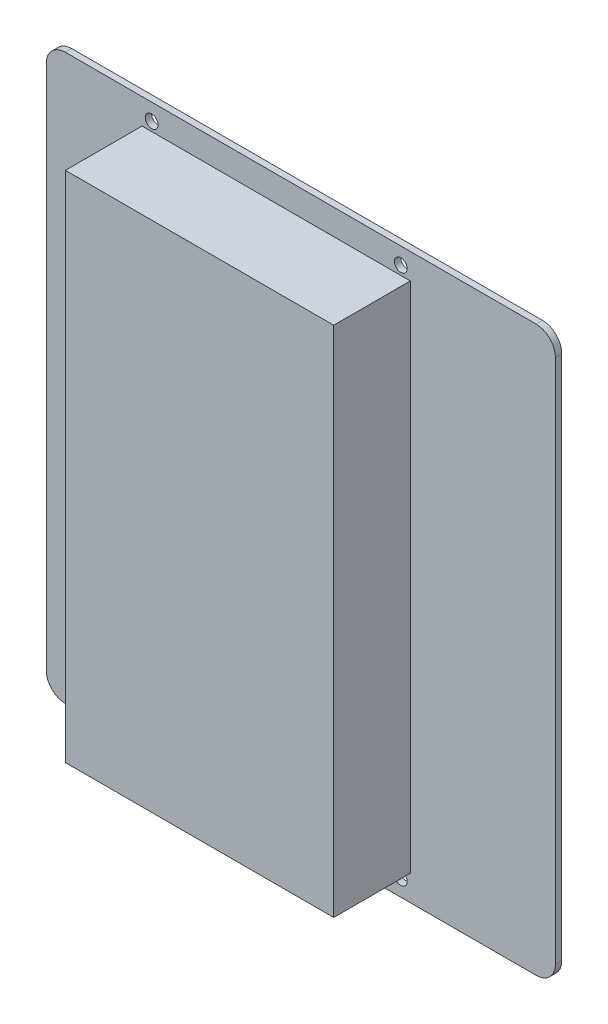
ISO-10303-21;
HEADER;
FILE_DESCRIPTION(('STEP AP214'),'2;1');
FILE_NAME('part.step','',(''),(''),'','','');
FILE_SCHEMA(('AUTOMOTIVE_DESIGN { 1 0 10303 214 1 1 1 1 }'));
ENDSEC;
DATA;
#1=APPLICATION_CONTEXT('core data for automotive mechanical design processes');
#2=APPLICATION_PROTOCOL_DEFINITION('international standard','automotive_design',2000,#1);
#3=PRODUCT_CONTEXT('',#1,'mechanical');
#4=PRODUCT('Part','Part','',(#3));
#5=PRODUCT_RELATED_PRODUCT_CATEGORY('part','',(#4));
#6=PRODUCT_DEFINITION_FORMATION('','',#4);
#7=PRODUCT_DEFINITION_CONTEXT('part definition',#1,'design');
#8=PRODUCT_DEFINITION('design','',#6,#7);
#9=PRODUCT_DEFINITION_SHAPE('','',#8);
#10=(LENGTH_UNIT() NAMED_UNIT(*) SI_UNIT(.MILLI.,.METRE.));
#11=(NAMED_UNIT(*) PLANE_ANGLE_UNIT() SI_UNIT($,.RADIAN.));
#12=(NAMED_UNIT(*) SI_UNIT($,.STERADIAN.) SOLID_ANGLE_UNIT());
#13=UNCERTAINTY_MEASURE_WITH_UNIT(LENGTH_MEASURE(1.E-05),#10,'distance_accuracy_value','');
#14=(GEOMETRIC_REPRESENTATION_CONTEXT(3) GLOBAL_UNCERTAINTY_ASSIGNED_CONTEXT((#13)) GLOBAL_UNIT_ASSIGNED_CONTEXT((#10,
#11,#12)) REPRESENTATION_CONTEXT('',''));
#15=CARTESIAN_POINT('',(0.,0.,0.));
#16=DIRECTION('',(0.,0.,1.));
#17=DIRECTION('',(1.,0.,0.));
#18=AXIS2_PLACEMENT_3D('',#15,#16,#17);
#19=CARTESIAN_POINT('',(-46.7995,52.2605,1.27));
#20=DIRECTION('',(0.,0.,1.));
#21=DIRECTION('',(1.,0.,0.));
#22=AXIS2_PLACEMENT_3D('',#19,#20,#21);
#23=PLANE('',#22);
#24=CARTESIAN_POINT('',(19.8755,-52.7685,1.27));
#25=DIRECTION('',(0.,0.,1.));
#26=DIRECTION('',(1.,0.,0.));
#27=AXIS2_PLACEMENT_3D('',#24,#25,#26);
#28=CIRCLE('',#27,1.27);
#29=CARTESIAN_POINT('',(21.1455,-52.7685,1.27));
#30=VERTEX_POINT('',#29);
#31=EDGE_CURVE('E264',#30,#30,#28,.T.);
#32=ORIENTED_EDGE('',*,*,#31,.F.);
#33=EDGE_LOOP('',(#32));
#34=FACE_BOUND('',#33,.T.);
#35=CARTESIAN_POINT('',(-29.6545,-52.7685,1.27));
#36=DIRECTION('',(0.,0.,1.));
#37=DIRECTION('',(1.,0.,0.));
#38=AXIS2_PLACEMENT_3D('',#35,#36,#37);
#39=CIRCLE('',#38,1.27);
#40=CARTESIAN_POINT('',(-28.3845,-52.7685,1.27));
#41=VERTEX_POINT('',#40);
#42=EDGE_CURVE('E274',#41,#41,#39,.T.);
#43=ORIENTED_EDGE('',*,*,#42,.F.);
#44=EDGE_LOOP('',(#43));
#45=FACE_BOUND('',#44,.T.);
#46=CARTESIAN_POINT('',(19.8755,52.7685,1.27));
#47=DIRECTION('',(0.,0.,1.));
#48=DIRECTION('',(1.,0.,0.));
#49=AXIS2_PLACEMENT_3D('',#46,#47,#48);
#50=CIRCLE('',#49,1.27);
#51=CARTESIAN_POINT('',(21.1455,52.7685,1.27));
#52=VERTEX_POINT('',#51);
#53=EDGE_CURVE('E280',#52,#52,#50,.T.);
#54=ORIENTED_EDGE('',*,*,#53,.F.);
#55=EDGE_LOOP('',(#54));
#56=FACE_BOUND('',#55,.T.);
#57=CARTESIAN_POINT('',(-29.6545,52.7685,1.27));
#58=DIRECTION('',(0.,0.,1.));
#59=DIRECTION('',(1.,0.,0.));
#60=AXIS2_PLACEMENT_3D('',#57,#58,#59);
#61=CIRCLE('',#60,1.27);
#62=CARTESIAN_POINT('',(-28.3845,52.7685,1.27));
#63=VERTEX_POINT('',#62);
#64=EDGE_CURVE('E286',#63,#63,#61,.T.);
#65=ORIENTED_EDGE('',*,*,#64,.F.);
#66=EDGE_LOOP('',(#65));
#67=FACE_BOUND('',#66,.T.);
#68=CARTESIAN_POINT('',(-46.7995,52.2605,1.27));
#69=DIRECTION('',(0.,0.,1.));
#70=DIRECTION('',(1.,0.,0.));
#71=AXIS2_PLACEMENT_3D('',#68,#69,#70);
#72=CIRCLE('',#71,3.81);
#73=CARTESIAN_POINT('',(-46.7994999999999,56.0705,1.27));
#74=VERTEX_POINT('',#73);
#75=CARTESIAN_POINT('',(-50.6095,52.2605,1.27));
#76=VERTEX_POINT('',#75);
#77=EDGE_CURVE('E108',#74,#76,#72,.T.);
#78=ORIENTED_EDGE('',*,*,#77,.T.);
#79=DIRECTION('',(0.,1.,0.));
#80=VECTOR('',#79,1.);
#81=CARTESIAN_POINT('',(-50.6095,-52.2605,1.27));
#82=LINE('',#81,#80);
#83=CARTESIAN_POINT('',(-50.6095,-52.2605,1.27));
#84=VERTEX_POINT('',#83);
#85=EDGE_CURVE('E200',#84,#76,#82,.T.);
#86=ORIENTED_EDGE('',*,*,#85,.F.);
#87=CARTESIAN_POINT('',(-46.7995,-52.2605,1.27));
#88=DIRECTION('',(0.,0.,-1.));
#89=DIRECTION('',(-1.,0.,0.));
#90=AXIS2_PLACEMENT_3D('',#87,#88,#89);
#91=CIRCLE('',#90,3.81);
#92=CARTESIAN_POINT('',(-46.7994999999999,-56.0705,1.27));
#93=VERTEX_POINT('',#92);
#94=EDGE_CURVE('E188',#93,#84,#91,.T.);
#95=ORIENTED_EDGE('',*,*,#94,.F.);
#96=DIRECTION('',(-1.,0.,0.));
#97=VECTOR('',#96,1.);
#98=CARTESIAN_POINT('',(46.7995,-56.0705,1.27));
#99=LINE('',#98,#97);
#100=CARTESIAN_POINT('',(46.7995,-56.0705,1.27));
#101=VERTEX_POINT('',#100);
#102=EDGE_CURVE('E199',#101,#93,#99,.T.);
#103=ORIENTED_EDGE('',*,*,#102,.F.);
#104=CARTESIAN_POINT('',(46.7995,-52.2605,1.27));
#105=DIRECTION('',(0.,0.,-1.));
#106=DIRECTION('',(-1.,0.,0.));
#107=AXIS2_PLACEMENT_3D('',#104,#105,#106);
#108=CIRCLE('',#107,3.81);
#109=CARTESIAN_POINT('',(50.6095,-52.2605,1.27));
#110=VERTEX_POINT('',#109);
#111=EDGE_CURVE('E147',#110,#101,#108,.T.);
#112=ORIENTED_EDGE('',*,*,#111,.F.);
#113=DIRECTION('',(0.,-1.,0.));
#114=VECTOR('',#113,1.);
#115=CARTESIAN_POINT('',(50.6095,52.2605,1.27));
#116=LINE('',#115,#114);
#117=CARTESIAN_POINT('',(50.6095,52.2605,1.27));
#118=VERTEX_POINT('',#117);
#119=EDGE_CURVE('E131',#118,#110,#116,.T.);
#120=ORIENTED_EDGE('',*,*,#119,.F.);
#121=CARTESIAN_POINT('',(46.7995,52.2605,1.27));
#122=DIRECTION('',(0.,0.,-1.));
#123=DIRECTION('',(-1.,0.,0.));
#124=AXIS2_PLACEMENT_3D('',#121,#122,#123);
#125=CIRCLE('',#124,3.81);
#126=CARTESIAN_POINT('',(46.7995,56.0705,1.27));
#127=VERTEX_POINT('',#126);
#128=EDGE_CURVE('E144',#127,#118,#125,.T.);
#129=ORIENTED_EDGE('',*,*,#128,.F.);
#130=DIRECTION('',(1.,0.,0.));
#131=VECTOR('',#130,1.);
#132=CARTESIAN_POINT('',(-46.7994999999999,56.0705,1.27));
#133=LINE('',#132,#131);
#134=EDGE_CURVE('E150',#74,#127,#133,.T.);
#135=ORIENTED_EDGE('',*,*,#134,.F.);
#136=EDGE_LOOP('',(#78,#86,#95,#103,#112,#120,#129,#135));
#137=FACE_BOUND('',#136,.T.);
#138=DIRECTION('',(1.,0.,0.));
#139=VECTOR('',#138,1.);
#140=CARTESIAN_POINT('',(21.7805,-50.9905,1.27));
#141=LINE('',#140,#139);
#142=CARTESIAN_POINT('',(-31.5595,-50.9905,1.27));
#143=VERTEX_POINT('',#142);
#144=CARTESIAN_POINT('',(21.7805,-50.9905,1.27));
#145=VERTEX_POINT('',#144);
#146=EDGE_CURVE('E306',#143,#145,#141,.T.);
#147=ORIENTED_EDGE('',*,*,#146,.F.);
#148=DIRECTION('',(0.,-1.,0.));
#149=VECTOR('',#148,1.);
#150=CARTESIAN_POINT('',(-31.5595,-50.9905,1.27));
#151=LINE('',#150,#149);
#152=CARTESIAN_POINT('',(-31.5595,50.9905,1.27));
#153=VERTEX_POINT('',#152);
#154=EDGE_CURVE('E289',#153,#143,#151,.T.);
#155=ORIENTED_EDGE('',*,*,#154,.F.);
#156=DIRECTION('',(-1.,0.,0.));
#157=VECTOR('',#156,1.);
#158=CARTESIAN_POINT('',(-31.5595,50.9905,1.27));
#159=LINE('',#158,#157);
#160=CARTESIAN_POINT('',(21.7805,50.9905,1.27));
#161=VERTEX_POINT('',#160);
#162=EDGE_CURVE('E294',#161,#153,#159,.T.);
#163=ORIENTED_EDGE('',*,*,#162,.F.);
#164=DIRECTION('',(0.,1.,0.));
#165=VECTOR('',#164,1.);
#166=CARTESIAN_POINT('',(21.7805,50.9905,1.27));
#167=LINE('',#166,#165);
#168=EDGE_CURVE('E309',#145,#161,#167,.T.);
#169=ORIENTED_EDGE('',*,*,#168,.F.);
#170=EDGE_LOOP('',(#147,#155,#163,#169));
#171=FACE_BOUND('',#170,.T.);
#172=ADVANCED_FACE('F46',(#34,#45,#56,#67,#137,#171),#23,.T.);
#173=CARTESIAN_POINT('',(-46.7995,52.2605,1.27));
#174=DIRECTION('',(0.,0.,-1.));
#175=DIRECTION('',(-1.,0.,0.));
#176=AXIS2_PLACEMENT_3D('',#173,#174,#175);
#177=CYLINDRICAL_SURFACE('',#176,3.81);
#178=CARTESIAN_POINT('',(-46.7995,52.2605,0.));
#179=DIRECTION('',(0.,0.,1.));
#180=DIRECTION('',(1.,0.,0.));
#181=AXIS2_PLACEMENT_3D('',#178,#179,#180);
#182=CIRCLE('',#181,3.81);
#183=CARTESIAN_POINT('',(-46.7994999999999,56.0705,0.));
#184=VERTEX_POINT('',#183);
#185=CARTESIAN_POINT('',(-50.6095,52.2605,0.));
#186=VERTEX_POINT('',#185);
#187=EDGE_CURVE('E155',#184,#186,#182,.T.);
#188=ORIENTED_EDGE('',*,*,#187,.T.);
#189=DIRECTION('',(0.,0.,-1.));
#190=VECTOR('',#189,1.);
#191=CARTESIAN_POINT('',(-50.6095,52.2605,1.27));
#192=LINE('',#191,#190);
#193=EDGE_CURVE('E13',#76,#186,#192,.T.);
#194=ORIENTED_EDGE('',*,*,#193,.F.);
#195=ORIENTED_EDGE('',*,*,#77,.F.);
#196=DIRECTION('',(0.,0.,-1.));
#197=VECTOR('',#196,1.);
#198=CARTESIAN_POINT('',(-46.7994999999999,56.0705,1.27));
#199=LINE('',#198,#197);
#200=EDGE_CURVE('E70',#74,#184,#199,.T.);
#201=ORIENTED_EDGE('',*,*,#200,.T.);
#202=EDGE_LOOP('',(#188,#194,#195,#201));
#203=FACE_BOUND('',#202,.T.);
#204=ADVANCED_FACE('F48',(#203),#177,.T.);
#205=CARTESIAN_POINT('',(-50.6095,-52.2605,1.27));
#206=DIRECTION('',(-1.,0.,0.));
#207=DIRECTION('',(0.,0.,1.));
#208=AXIS2_PLACEMENT_3D('',#205,#206,#207);
#209=PLANE('',#208);
#210=DIRECTION('',(0.,1.,0.));
#211=VECTOR('',#210,1.);
#212=CARTESIAN_POINT('',(-50.6095,-52.2605,0.));
#213=LINE('',#212,#211);
#214=CARTESIAN_POINT('',(-50.6095,-52.2605,0.));
#215=VERTEX_POINT('',#214);
#216=EDGE_CURVE('E157',#215,#186,#213,.T.);
#217=ORIENTED_EDGE('',*,*,#216,.F.);
#218=DIRECTION('',(0.,0.,-1.));
#219=VECTOR('',#218,1.);
#220=CARTESIAN_POINT('',(-50.6095,-52.2605,1.27));
#221=LINE('',#220,#219);
#222=EDGE_CURVE('E54',#84,#215,#221,.T.);
#223=ORIENTED_EDGE('',*,*,#222,.F.);
#224=ORIENTED_EDGE('',*,*,#85,.T.);
#225=ORIENTED_EDGE('',*,*,#193,.T.);
#226=EDGE_LOOP('',(#217,#223,#224,#225));
#227=FACE_BOUND('',#226,.T.);
#228=ADVANCED_FACE('F191',(#227),#209,.T.);
#229=CARTESIAN_POINT('',(-46.7995,-52.2605,1.27));
#230=DIRECTION('',(0.,0.,-1.));
#231=DIRECTION('',(-1.,0.,0.));
#232=AXIS2_PLACEMENT_3D('',#229,#230,#231);
#233=CYLINDRICAL_SURFACE('',#232,3.81);
#234=CARTESIAN_POINT('',(-46.7995,-52.2605,0.));
#235=DIRECTION('',(0.,0.,-1.));
#236=DIRECTION('',(-1.,0.,0.));
#237=AXIS2_PLACEMENT_3D('',#234,#235,#236);
#238=CIRCLE('',#237,3.81);
#239=CARTESIAN_POINT('',(-46.7994999999999,-56.0705,0.));
#240=VERTEX_POINT('',#239);
#241=EDGE_CURVE('E161',#240,#215,#238,.T.);
#242=ORIENTED_EDGE('',*,*,#241,.F.);
#243=DIRECTION('',(0.,0.,-1.));
#244=VECTOR('',#243,1.);
#245=CARTESIAN_POINT('',(-46.7994999999999,-56.0705,1.27));
#246=LINE('',#245,#244);
#247=EDGE_CURVE('E181',#93,#240,#246,.T.);
#248=ORIENTED_EDGE('',*,*,#247,.F.);
#249=ORIENTED_EDGE('',*,*,#94,.T.);
#250=ORIENTED_EDGE('',*,*,#222,.T.);
#251=EDGE_LOOP('',(#242,#248,#249,#250));
#252=FACE_BOUND('',#251,.T.);
#253=ADVANCED_FACE('F186',(#252),#233,.T.);
#254=CARTESIAN_POINT('',(46.7995,-56.0705,1.27));
#255=DIRECTION('',(0.,-1.,0.));
#256=DIRECTION('',(1.,0.,0.));
#257=AXIS2_PLACEMENT_3D('',#254,#255,#256);
#258=PLANE('',#257);
#259=DIRECTION('',(-1.,0.,0.));
#260=VECTOR('',#259,1.);
#261=CARTESIAN_POINT('',(46.7995,-56.0705,0.));
#262=LINE('',#261,#260);
#263=CARTESIAN_POINT('',(46.7995,-56.0705,0.));
#264=VERTEX_POINT('',#263);
#265=EDGE_CURVE('E164',#264,#240,#262,.T.);
#266=ORIENTED_EDGE('',*,*,#265,.F.);
#267=DIRECTION('',(0.,0.,-1.));
#268=VECTOR('',#267,1.);
#269=CARTESIAN_POINT('',(46.7995,-56.0705,1.27));
#270=LINE('',#269,#268);
#271=EDGE_CURVE('E179',#101,#264,#270,.T.);
#272=ORIENTED_EDGE('',*,*,#271,.F.);
#273=ORIENTED_EDGE('',*,*,#102,.T.);
#274=ORIENTED_EDGE('',*,*,#247,.T.);
#275=EDGE_LOOP('',(#266,#272,#273,#274));
#276=FACE_BOUND('',#275,.T.);
#277=ADVANCED_FACE('F197',(#276),#258,.T.);
#278=CARTESIAN_POINT('',(46.7995,-52.2605,1.27));
#279=DIRECTION('',(0.,0.,-1.));
#280=DIRECTION('',(-1.,0.,0.));
#281=AXIS2_PLACEMENT_3D('',#278,#279,#280);
#282=CYLINDRICAL_SURFACE('',#281,3.81);
#283=CARTESIAN_POINT('',(46.7995,-52.2605,0.));
#284=DIRECTION('',(0.,0.,-1.));
#285=DIRECTION('',(-1.,0.,0.));
#286=AXIS2_PLACEMENT_3D('',#283,#284,#285);
#287=CIRCLE('',#286,3.81);
#288=CARTESIAN_POINT('',(50.6095,-52.2605,0.));
#289=VERTEX_POINT('',#288);
#290=EDGE_CURVE('E167',#289,#264,#287,.T.);
#291=ORIENTED_EDGE('',*,*,#290,.F.);
#292=DIRECTION('',(0.,0.,-1.));
#293=VECTOR('',#292,1.);
#294=CARTESIAN_POINT('',(50.6095,-52.2605,1.27));
#295=LINE('',#294,#293);
#296=EDGE_CURVE('E138',#110,#289,#295,.T.);
#297=ORIENTED_EDGE('',*,*,#296,.F.);
#298=ORIENTED_EDGE('',*,*,#111,.T.);
#299=ORIENTED_EDGE('',*,*,#271,.T.);
#300=EDGE_LOOP('',(#291,#297,#298,#299));
#301=FACE_BOUND('',#300,.T.);
#302=ADVANCED_FACE('F206',(#301),#282,.T.);
#303=CARTESIAN_POINT('',(50.6095,52.2605,1.27));
#304=DIRECTION('',(1.,0.,0.));
#305=DIRECTION('',(0.,1.,0.));
#306=AXIS2_PLACEMENT_3D('',#303,#304,#305);
#307=PLANE('',#306);
#308=DIRECTION('',(0.,-1.,0.));
#309=VECTOR('',#308,1.);
#310=CARTESIAN_POINT('',(50.6095,52.2605,0.));
#311=LINE('',#310,#309);
#312=CARTESIAN_POINT('',(50.6095,52.2605,0.));
#313=VERTEX_POINT('',#312);
#314=EDGE_CURVE('E133',#313,#289,#311,.T.);
#315=ORIENTED_EDGE('',*,*,#314,.F.);
#316=DIRECTION('',(0.,0.,-1.));
#317=VECTOR('',#316,1.);
#318=CARTESIAN_POINT('',(50.6095,52.2605,1.27));
#319=LINE('',#318,#317);
#320=EDGE_CURVE('E128',#118,#313,#319,.T.);
#321=ORIENTED_EDGE('',*,*,#320,.F.);
#322=ORIENTED_EDGE('',*,*,#119,.T.);
#323=ORIENTED_EDGE('',*,*,#296,.T.);
#324=EDGE_LOOP('',(#315,#321,#322,#323));
#325=FACE_BOUND('',#324,.T.);
#326=ADVANCED_FACE('F130',(#325),#307,.T.);
#327=CARTESIAN_POINT('',(46.7995,52.2605,1.27));
#328=DIRECTION('',(0.,0.,-1.));
#329=DIRECTION('',(-1.,0.,0.));
#330=AXIS2_PLACEMENT_3D('',#327,#328,#329);
#331=CYLINDRICAL_SURFACE('',#330,3.81);
#332=CARTESIAN_POINT('',(46.7995,52.2605,0.));
#333=DIRECTION('',(0.,0.,-1.));
#334=DIRECTION('',(-1.,0.,0.));
#335=AXIS2_PLACEMENT_3D('',#332,#333,#334);
#336=CIRCLE('',#335,3.81);
#337=CARTESIAN_POINT('',(46.7995,56.0705,0.));
#338=VERTEX_POINT('',#337);
#339=EDGE_CURVE('E171',#338,#313,#336,.T.);
#340=ORIENTED_EDGE('',*,*,#339,.F.);
#341=DIRECTION('',(0.,0.,-1.));
#342=VECTOR('',#341,1.);
#343=CARTESIAN_POINT('',(46.7995,56.0705,1.27));
#344=LINE('',#343,#342);
#345=EDGE_CURVE('E139',#127,#338,#344,.T.);
#346=ORIENTED_EDGE('',*,*,#345,.F.);
#347=ORIENTED_EDGE('',*,*,#128,.T.);
#348=ORIENTED_EDGE('',*,*,#320,.T.);
#349=EDGE_LOOP('',(#340,#346,#347,#348));
#350=FACE_BOUND('',#349,.T.);
#351=ADVANCED_FACE('F149',(#350),#331,.T.);
#352=CARTESIAN_POINT('',(-46.7994999999999,56.0705,1.27));
#353=DIRECTION('',(0.,1.,0.));
#354=DIRECTION('',(-1.,0.,0.));
#355=AXIS2_PLACEMENT_3D('',#352,#353,#354);
#356=PLANE('',#355);
#357=DIRECTION('',(1.,0.,0.));
#358=VECTOR('',#357,1.);
#359=CARTESIAN_POINT('',(-46.7994999999999,56.0705,0.));
#360=LINE('',#359,#358);
#361=EDGE_CURVE('E173',#184,#338,#360,.T.);
#362=ORIENTED_EDGE('',*,*,#361,.F.);
#363=ORIENTED_EDGE('',*,*,#200,.F.);
#364=ORIENTED_EDGE('',*,*,#134,.T.);
#365=ORIENTED_EDGE('',*,*,#345,.T.);
#366=EDGE_LOOP('',(#362,#363,#364,#365));
#367=FACE_BOUND('',#366,.T.);
#368=ADVANCED_FACE('F207',(#367),#356,.T.);
#369=CARTESIAN_POINT('',(-46.7995,52.2605,0.));
#370=DIRECTION('',(0.,0.,1.));
#371=DIRECTION('',(1.,0.,0.));
#372=AXIS2_PLACEMENT_3D('',#369,#370,#371);
#373=PLANE('',#372);
#374=CARTESIAN_POINT('',(19.8755,-52.7685,0.));
#375=DIRECTION('',(0.,0.,1.));
#376=DIRECTION('',(1.,0.,0.));
#377=AXIS2_PLACEMENT_3D('',#374,#375,#376);
#378=CIRCLE('',#377,1.27);
#379=CARTESIAN_POINT('',(21.1455,-52.7685,0.));
#380=VERTEX_POINT('',#379);
#381=EDGE_CURVE('E267',#380,#380,#378,.T.);
#382=ORIENTED_EDGE('',*,*,#381,.T.);
#383=EDGE_LOOP('',(#382));
#384=FACE_BOUND('',#383,.T.);
#385=CARTESIAN_POINT('',(-29.6545,-52.7685,0.));
#386=DIRECTION('',(0.,0.,1.));
#387=DIRECTION('',(1.,0.,0.));
#388=AXIS2_PLACEMENT_3D('',#385,#386,#387);
#389=CIRCLE('',#388,1.27);
#390=CARTESIAN_POINT('',(-28.3845,-52.7685,0.));
#391=VERTEX_POINT('',#390);
#392=EDGE_CURVE('E269',#391,#391,#389,.T.);
#393=ORIENTED_EDGE('',*,*,#392,.T.);
#394=EDGE_LOOP('',(#393));
#395=FACE_BOUND('',#394,.T.);
#396=CARTESIAN_POINT('',(19.8755,52.7685,0.));
#397=DIRECTION('',(0.,0.,1.));
#398=DIRECTION('',(1.,0.,0.));
#399=AXIS2_PLACEMENT_3D('',#396,#397,#398);
#400=CIRCLE('',#399,1.27);
#401=CARTESIAN_POINT('',(21.1455,52.7685,0.));
#402=VERTEX_POINT('',#401);
#403=EDGE_CURVE('E277',#402,#402,#400,.T.);
#404=ORIENTED_EDGE('',*,*,#403,.T.);
#405=EDGE_LOOP('',(#404));
#406=FACE_BOUND('',#405,.T.);
#407=CARTESIAN_POINT('',(-29.6545,52.7685,0.));
#408=DIRECTION('',(0.,0.,1.));
#409=DIRECTION('',(1.,0.,0.));
#410=AXIS2_PLACEMENT_3D('',#407,#408,#409);
#411=CIRCLE('',#410,1.27);
#412=CARTESIAN_POINT('',(-28.3845,52.7685,0.));
#413=VERTEX_POINT('',#412);
#414=EDGE_CURVE('E283',#413,#413,#411,.T.);
#415=ORIENTED_EDGE('',*,*,#414,.T.);
#416=EDGE_LOOP('',(#415));
#417=FACE_BOUND('',#416,.T.);
#418=ORIENTED_EDGE('',*,*,#187,.F.);
#419=ORIENTED_EDGE('',*,*,#361,.T.);
#420=ORIENTED_EDGE('',*,*,#339,.T.);
#421=ORIENTED_EDGE('',*,*,#314,.T.);
#422=ORIENTED_EDGE('',*,*,#290,.T.);
#423=ORIENTED_EDGE('',*,*,#265,.T.);
#424=ORIENTED_EDGE('',*,*,#241,.T.);
#425=ORIENTED_EDGE('',*,*,#216,.T.);
#426=EDGE_LOOP('',(#418,#419,#420,#421,#422,#423,#424,#425));
#427=FACE_BOUND('',#426,.T.);
#428=ADVANCED_FACE('F193',(#384,#395,#406,#417,#427),#373,.F.);
#429=CARTESIAN_POINT('',(-31.5595,-50.9905,16.51));
#430=DIRECTION('',(1.,0.,0.));
#431=DIRECTION('',(0.,0.,-1.));
#432=AXIS2_PLACEMENT_3D('',#429,#430,#431);
#433=PLANE('',#432);
#434=ORIENTED_EDGE('',*,*,#154,.T.);
#435=DIRECTION('',(0.,0.,-1.));
#436=VECTOR('',#435,1.);
#437=CARTESIAN_POINT('',(-31.5595,-50.9905,16.51));
#438=LINE('',#437,#436);
#439=CARTESIAN_POINT('',(-31.5595,-50.9905,16.51));
#440=VERTEX_POINT('',#439);
#441=EDGE_CURVE('E158',#440,#143,#438,.T.);
#442=ORIENTED_EDGE('',*,*,#441,.F.);
#443=DIRECTION('',(0.,-1.,0.));
#444=VECTOR('',#443,1.);
#445=CARTESIAN_POINT('',(-31.5595,-50.9905,16.51));
#446=LINE('',#445,#444);
#447=CARTESIAN_POINT('',(-31.5595,50.9905,16.51));
#448=VERTEX_POINT('',#447);
#449=EDGE_CURVE('E290',#448,#440,#446,.T.);
#450=ORIENTED_EDGE('',*,*,#449,.F.);
#451=DIRECTION('',(0.,0.,-1.));
#452=VECTOR('',#451,1.);
#453=CARTESIAN_POINT('',(-31.5595,50.9905,16.51));
#454=LINE('',#453,#452);
#455=EDGE_CURVE('E303',#448,#153,#454,.T.);
#456=ORIENTED_EDGE('',*,*,#455,.T.);
#457=EDGE_LOOP('',(#434,#442,#450,#456));
#458=FACE_BOUND('',#457,.T.);
#459=ADVANCED_FACE('F214',(#458),#433,.F.);
#460=CARTESIAN_POINT('',(21.7805,-50.9905,16.51));
#461=DIRECTION('',(0.,1.,0.));
#462=DIRECTION('',(0.,0.,1.));
#463=AXIS2_PLACEMENT_3D('',#460,#461,#462);
#464=PLANE('',#463);
#465=ORIENTED_EDGE('',*,*,#146,.T.);
#466=DIRECTION('',(0.,0.,-1.));
#467=VECTOR('',#466,1.);
#468=CARTESIAN_POINT('',(21.7805,-50.9905,16.51));
#469=LINE('',#468,#467);
#470=CARTESIAN_POINT('',(21.7805,-50.9905,16.51));
#471=VERTEX_POINT('',#470);
#472=EDGE_CURVE('E315',#471,#145,#469,.T.);
#473=ORIENTED_EDGE('',*,*,#472,.F.);
#474=DIRECTION('',(1.,0.,0.));
#475=VECTOR('',#474,1.);
#476=CARTESIAN_POINT('',(21.7805,-50.9905,16.51));
#477=LINE('',#476,#475);
#478=EDGE_CURVE('E293',#440,#471,#477,.T.);
#479=ORIENTED_EDGE('',*,*,#478,.F.);
#480=ORIENTED_EDGE('',*,*,#441,.T.);
#481=EDGE_LOOP('',(#465,#473,#479,#480));
#482=FACE_BOUND('',#481,.T.);
#483=ADVANCED_FACE('F229',(#482),#464,.F.);
#484=CARTESIAN_POINT('',(21.7805,50.9905,16.51));
#485=DIRECTION('',(-1.,0.,0.));
#486=DIRECTION('',(0.,-1.,0.));
#487=AXIS2_PLACEMENT_3D('',#484,#485,#486);
#488=PLANE('',#487);
#489=ORIENTED_EDGE('',*,*,#168,.T.);
#490=DIRECTION('',(0.,0.,-1.));
#491=VECTOR('',#490,1.);
#492=CARTESIAN_POINT('',(21.7805,50.9905,16.51));
#493=LINE('',#492,#491);
#494=CARTESIAN_POINT('',(21.7805,50.9905,16.51));
#495=VERTEX_POINT('',#494);
#496=EDGE_CURVE('E61',#495,#161,#493,.T.);
#497=ORIENTED_EDGE('',*,*,#496,.F.);
#498=DIRECTION('',(0.,1.,0.));
#499=VECTOR('',#498,1.);
#500=CARTESIAN_POINT('',(21.7805,50.9905,16.51));
#501=LINE('',#500,#499);
#502=EDGE_CURVE('E297',#471,#495,#501,.T.);
#503=ORIENTED_EDGE('',*,*,#502,.F.);
#504=ORIENTED_EDGE('',*,*,#472,.T.);
#505=EDGE_LOOP('',(#489,#497,#503,#504));
#506=FACE_BOUND('',#505,.T.);
#507=ADVANCED_FACE('F233',(#506),#488,.F.);
#508=CARTESIAN_POINT('',(-31.5595,50.9905,16.51));
#509=DIRECTION('',(0.,-1.,0.));
#510=DIRECTION('',(0.,0.,-1.));
#511=AXIS2_PLACEMENT_3D('',#508,#509,#510);
#512=PLANE('',#511);
#513=ORIENTED_EDGE('',*,*,#162,.T.);
#514=ORIENTED_EDGE('',*,*,#455,.F.);
#515=DIRECTION('',(-1.,0.,0.));
#516=VECTOR('',#515,1.);
#517=CARTESIAN_POINT('',(-31.5595,50.9905,16.51));
#518=LINE('',#517,#516);
#519=EDGE_CURVE('E300',#495,#448,#518,.T.);
#520=ORIENTED_EDGE('',*,*,#519,.F.);
#521=ORIENTED_EDGE('',*,*,#496,.T.);
#522=EDGE_LOOP('',(#513,#514,#520,#521));
#523=FACE_BOUND('',#522,.T.);
#524=ADVANCED_FACE('F237',(#523),#512,.F.);
#525=CARTESIAN_POINT('',(0.,0.,16.51));
#526=DIRECTION('',(0.,0.,-1.));
#527=DIRECTION('',(-1.,0.,0.));
#528=AXIS2_PLACEMENT_3D('',#525,#526,#527);
#529=PLANE('',#528);
#530=ORIENTED_EDGE('',*,*,#449,.T.);
#531=ORIENTED_EDGE('',*,*,#478,.T.);
#532=ORIENTED_EDGE('',*,*,#502,.T.);
#533=ORIENTED_EDGE('',*,*,#519,.T.);
#534=EDGE_LOOP('',(#530,#531,#532,#533));
#535=FACE_BOUND('',#534,.T.);
#536=ADVANCED_FACE('F241',(#535),#529,.F.);
#537=CARTESIAN_POINT('',(-29.6545,52.7685,0.));
#538=DIRECTION('',(0.,0.,1.));
#539=DIRECTION('',(1.,0.,0.));
#540=AXIS2_PLACEMENT_3D('',#537,#538,#539);
#541=CYLINDRICAL_SURFACE('',#540,1.27);
#542=ORIENTED_EDGE('',*,*,#64,.T.);
#543=EDGE_LOOP('',(#542));
#544=FACE_BOUND('',#543,.T.);
#545=ORIENTED_EDGE('',*,*,#414,.F.);
#546=EDGE_LOOP('',(#545));
#547=FACE_BOUND('',#546,.T.);
#548=ADVANCED_FACE('F244',(#544,#547),#541,.F.);
#549=CARTESIAN_POINT('',(19.8755,52.7685,0.));
#550=DIRECTION('',(0.,0.,1.));
#551=DIRECTION('',(1.,0.,0.));
#552=AXIS2_PLACEMENT_3D('',#549,#550,#551);
#553=CYLINDRICAL_SURFACE('',#552,1.27);
#554=ORIENTED_EDGE('',*,*,#53,.T.);
#555=EDGE_LOOP('',(#554));
#556=FACE_BOUND('',#555,.T.);
#557=ORIENTED_EDGE('',*,*,#403,.F.);
#558=EDGE_LOOP('',(#557));
#559=FACE_BOUND('',#558,.T.);
#560=ADVANCED_FACE('F248',(#556,#559),#553,.F.);
#561=CARTESIAN_POINT('',(-29.6545,-52.7685,0.));
#562=DIRECTION('',(0.,0.,1.));
#563=DIRECTION('',(1.,0.,0.));
#564=AXIS2_PLACEMENT_3D('',#561,#562,#563);
#565=CYLINDRICAL_SURFACE('',#564,1.27);
#566=ORIENTED_EDGE('',*,*,#42,.T.);
#567=EDGE_LOOP('',(#566));
#568=FACE_BOUND('',#567,.T.);
#569=ORIENTED_EDGE('',*,*,#392,.F.);
#570=EDGE_LOOP('',(#569));
#571=FACE_BOUND('',#570,.T.);
#572=ADVANCED_FACE('F252',(#568,#571),#565,.F.);
#573=CARTESIAN_POINT('',(19.8755,-52.7685,0.));
#574=DIRECTION('',(0.,0.,1.));
#575=DIRECTION('',(1.,0.,0.));
#576=AXIS2_PLACEMENT_3D('',#573,#574,#575);
#577=CYLINDRICAL_SURFACE('',#576,1.27);
#578=ORIENTED_EDGE('',*,*,#31,.T.);
#579=EDGE_LOOP('',(#578));
#580=FACE_BOUND('',#579,.T.);
#581=ORIENTED_EDGE('',*,*,#381,.F.);
#582=EDGE_LOOP('',(#581));
#583=FACE_BOUND('',#582,.T.);
#584=ADVANCED_FACE('F256',(#580,#583),#577,.F.);
#585=CLOSED_SHELL('',(#172,#204,#228,#253,#277,#302,#326,#351,#368,#428,#459,#483,#507,#524,
#536,#548,#560,#572,#584));
#586=MANIFOLD_SOLID_BREP('B2',#585);
#587=ADVANCED_BREP_SHAPE_REPRESENTATION('',(#18,#586),#14);
#588=SHAPE_DEFINITION_REPRESENTATION(#9,#587);
ENDSEC;
END-ISO-10303-21;
